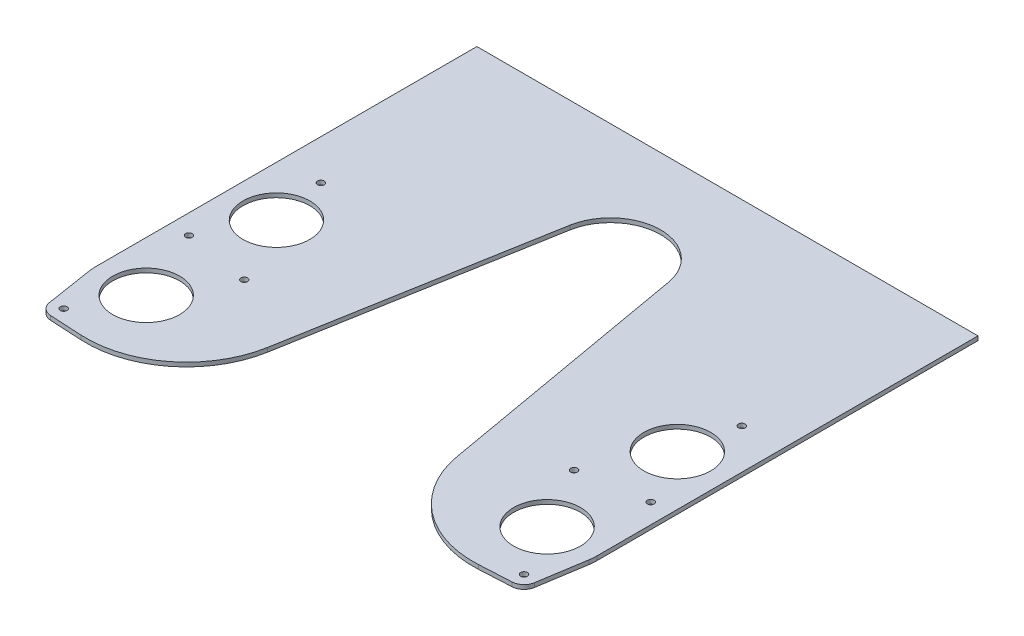
ISO-10303-21;
HEADER;
FILE_DESCRIPTION(('STEP AP214'),'2;1');
FILE_NAME('part.step','',(''),(''),'','','');
FILE_SCHEMA(('AUTOMOTIVE_DESIGN { 1 0 10303 214 1 1 1 1 }'));
ENDSEC;
DATA;
#1=APPLICATION_CONTEXT('core data for automotive mechanical design processes');
#2=APPLICATION_PROTOCOL_DEFINITION('international standard','automotive_design',2000,#1);
#3=PRODUCT_CONTEXT('',#1,'mechanical');
#4=PRODUCT('Part','Part','',(#3));
#5=PRODUCT_RELATED_PRODUCT_CATEGORY('part','',(#4));
#6=PRODUCT_DEFINITION_FORMATION('','',#4);
#7=PRODUCT_DEFINITION_CONTEXT('part definition',#1,'design');
#8=PRODUCT_DEFINITION('design','',#6,#7);
#9=PRODUCT_DEFINITION_SHAPE('','',#8);
#10=(LENGTH_UNIT() NAMED_UNIT(*) SI_UNIT(.MILLI.,.METRE.));
#11=(NAMED_UNIT(*) PLANE_ANGLE_UNIT() SI_UNIT($,.RADIAN.));
#12=(NAMED_UNIT(*) SI_UNIT($,.STERADIAN.) SOLID_ANGLE_UNIT());
#13=UNCERTAINTY_MEASURE_WITH_UNIT(LENGTH_MEASURE(1.E-05),#10,'distance_accuracy_value','');
#14=(GEOMETRIC_REPRESENTATION_CONTEXT(3) GLOBAL_UNCERTAINTY_ASSIGNED_CONTEXT((#13)) GLOBAL_UNIT_ASSIGNED_CONTEXT((#10,
#11,#12)) REPRESENTATION_CONTEXT('',''));
#15=CARTESIAN_POINT('',(0.,0.,0.));
#16=DIRECTION('',(0.,0.,1.));
#17=DIRECTION('',(1.,0.,0.));
#18=AXIS2_PLACEMENT_3D('',#15,#16,#17);
#19=CARTESIAN_POINT('',(-38.1000000000001,3.175,289.5092));
#20=DIRECTION('',(0.,-1.,0.));
#21=DIRECTION('',(0.,0.,-1.));
#22=AXIS2_PLACEMENT_3D('',#19,#20,#21);
#23=PLANE('',#22);
#24=DIRECTION('',(0.,0.,1.));
#25=VECTOR('',#24,1.);
#26=CARTESIAN_POINT('',(-381.,3.175,289.5092));
#27=LINE('',#26,#25);
#28=CARTESIAN_POINT('',(-381.,3.175,0.));
#29=VERTEX_POINT('',#28);
#30=CARTESIAN_POINT('',(-381.,3.175,289.5092));
#31=VERTEX_POINT('',#30);
#32=EDGE_CURVE('E231',#29,#31,#27,.T.);
#33=ORIENTED_EDGE('',*,*,#32,.T.);
#34=CARTESIAN_POINT('',(-342.9,3.175,289.5092));
#35=DIRECTION('',(0.,1.,0.));
#36=DIRECTION('',(0.,0.,1.));
#37=AXIS2_PLACEMENT_3D('',#34,#35,#36);
#38=CIRCLE('',#37,38.1000000000001);
#39=CARTESIAN_POINT('',(-380.532803673953,3.175,295.457484428109));
#40=VERTEX_POINT('',#39);
#41=EDGE_CURVE('E130',#31,#40,#38,.T.);
#42=ORIENTED_EDGE('',*,*,#41,.T.);
#43=DIRECTION('',(0.156122950869,0.,0.987737629237621));
#44=VECTOR('',#43,1.);
#45=CARTESIAN_POINT('',(-380.532803673953,3.175,295.457484428109));
#46=LINE('',#45,#44);
#47=CARTESIAN_POINT('',(-374.89739057959,3.175,331.110855944716));
#48=VERTEX_POINT('',#47);
#49=EDGE_CURVE('E271',#40,#48,#46,.T.);
#50=ORIENTED_EDGE('',*,*,#49,.T.);
#51=CARTESIAN_POINT('',(-365.489189661101,3.175,329.623784837689));
#52=DIRECTION('',(0.,1.,0.));
#53=DIRECTION('',(0.,0.,1.));
#54=AXIS2_PLACEMENT_3D('',#51,#52,#53);
#55=CIRCLE('',#54,9.52499999999997);
#56=CARTESIAN_POINT('',(-366.003133246036,3.175,339.134909218723));
#57=VERTEX_POINT('',#56);
#58=EDGE_CURVE('E290',#48,#57,#55,.T.);
#59=ORIENTED_EDGE('',*,*,#58,.T.);
#60=DIRECTION('',(0.998543242103337,0.,0.0539573317516356));
#61=VECTOR('',#60,1.);
#62=CARTESIAN_POINT('',(-366.003133246036,3.175,339.134909218723));
#63=LINE('',#62,#61);
#64=CARTESIAN_POINT('',(-341.613815413618,3.175,340.452811596899));
#65=VERTEX_POINT('',#64);
#66=EDGE_CURVE('E287',#57,#65,#63,.T.);
#67=ORIENTED_EDGE('',*,*,#66,.T.);
#68=CARTESIAN_POINT('',(-337.502266734144,3.175,264.363816548625));
#69=DIRECTION('',(0.,1.,0.));
#70=DIRECTION('',(0.,0.,1.));
#71=AXIS2_PLACEMENT_3D('',#68,#69,#70);
#72=CIRCLE('',#71,76.1999999999999);
#73=CARTESIAN_POINT('',(-262.459915954614,3.175,277.595807686845));
#74=VERTEX_POINT('',#73);
#75=EDGE_CURVE('E289',#65,#74,#72,.T.);
#76=ORIENTED_EDGE('',*,*,#75,.T.);
#77=DIRECTION('',(0.173648177666931,0.,-0.984807753012208));
#78=VECTOR('',#77,1.);
#79=CARTESIAN_POINT('',(-228.021175389765,3.175,82.28400443089));
#80=LINE('',#79,#78);
#81=CARTESIAN_POINT('',(-228.021175389765,3.175,82.28400443089));
#82=VERTEX_POINT('',#81);
#83=EDGE_CURVE('E292',#74,#82,#80,.T.);
#84=ORIENTED_EDGE('',*,*,#83,.T.);
#85=CARTESIAN_POINT('',(-190.5,3.175,88.9));
#86=DIRECTION('',(0.,-1.,0.));
#87=DIRECTION('',(0.,0.,1.));
#88=AXIS2_PLACEMENT_3D('',#85,#86,#87);
#89=CIRCLE('',#88,38.1);
#90=CARTESIAN_POINT('',(-152.978824610235,3.175,82.28400443089));
#91=VERTEX_POINT('',#90);
#92=EDGE_CURVE('E299',#82,#91,#89,.T.);
#93=ORIENTED_EDGE('',*,*,#92,.T.);
#94=DIRECTION('',(0.173648177666931,0.,0.984807753012208));
#95=VECTOR('',#94,1.);
#96=CARTESIAN_POINT('',(-152.978824610235,3.175,82.28400443089));
#97=LINE('',#96,#95);
#98=CARTESIAN_POINT('',(-118.540084045386,3.175,277.595807686845));
#99=VERTEX_POINT('',#98);
#100=EDGE_CURVE('E302',#91,#99,#97,.T.);
#101=ORIENTED_EDGE('',*,*,#100,.T.);
#102=CARTESIAN_POINT('',(-43.4977332658562,3.175,264.363816548625));
#103=DIRECTION('',(0.,1.,0.));
#104=DIRECTION('',(0.,0.,-1.));
#105=AXIS2_PLACEMENT_3D('',#102,#103,#104);
#106=CIRCLE('',#105,76.1999999999999);
#107=CARTESIAN_POINT('',(-39.3861845863814,3.175,340.452811596899));
#108=VERTEX_POINT('',#107);
#109=EDGE_CURVE('E305',#99,#108,#106,.T.);
#110=ORIENTED_EDGE('',*,*,#109,.T.);
#111=DIRECTION('',(0.998543242103337,0.,-0.0539573317516357));
#112=VECTOR('',#111,1.);
#113=CARTESIAN_POINT('',(-14.9968667539644,3.175,339.134909218723));
#114=LINE('',#113,#112);
#115=CARTESIAN_POINT('',(-14.9968667539644,3.175,339.134909218723));
#116=VERTEX_POINT('',#115);
#117=EDGE_CURVE('E307',#108,#116,#114,.T.);
#118=ORIENTED_EDGE('',*,*,#117,.T.);
#119=CARTESIAN_POINT('',(-15.5108103388987,3.175,329.623784837689));
#120=DIRECTION('',(0.,1.,0.));
#121=DIRECTION('',(0.,0.,-1.));
#122=AXIS2_PLACEMENT_3D('',#119,#120,#121);
#123=CIRCLE('',#122,9.52499999999997);
#124=CARTESIAN_POINT('',(-6.10260942041041,3.175,331.110855944716));
#125=VERTEX_POINT('',#124);
#126=EDGE_CURVE('E309',#116,#125,#123,.T.);
#127=ORIENTED_EDGE('',*,*,#126,.T.);
#128=DIRECTION('',(0.156122950869,0.,-0.987737629237621));
#129=VECTOR('',#128,1.);
#130=CARTESIAN_POINT('',(-0.467196326046637,3.175,295.457484428109));
#131=LINE('',#130,#129);
#132=CARTESIAN_POINT('',(-0.467196326046609,3.175,295.457484428109));
#133=VERTEX_POINT('',#132);
#134=EDGE_CURVE('E174',#125,#133,#131,.T.);
#135=ORIENTED_EDGE('',*,*,#134,.T.);
#136=CARTESIAN_POINT('',(-38.1000000000001,3.175,289.5092));
#137=DIRECTION('',(0.,1.,0.));
#138=DIRECTION('',(0.,0.,-1.));
#139=AXIS2_PLACEMENT_3D('',#136,#137,#138);
#140=CIRCLE('',#139,38.1000000000002);
#141=CARTESIAN_POINT('',(0.,3.175,289.5092));
#142=VERTEX_POINT('',#141);
#143=EDGE_CURVE('E168',#133,#142,#140,.T.);
#144=ORIENTED_EDGE('',*,*,#143,.T.);
#145=DIRECTION('',(0.,0.,-1.));
#146=VECTOR('',#145,1.);
#147=CARTESIAN_POINT('',(0.,3.175,289.5092));
#148=LINE('',#147,#146);
#149=CARTESIAN_POINT('',(0.,3.175,0.));
#150=VERTEX_POINT('',#149);
#151=EDGE_CURVE('E172',#142,#150,#148,.T.);
#152=ORIENTED_EDGE('',*,*,#151,.T.);
#153=DIRECTION('',(-1.,0.,0.));
#154=VECTOR('',#153,1.);
#155=CARTESIAN_POINT('',(0.,3.175,0.));
#156=LINE('',#155,#154);
#157=EDGE_CURVE('E62',#150,#29,#156,.T.);
#158=ORIENTED_EDGE('',*,*,#157,.T.);
#159=EDGE_LOOP('',(#33,#42,#50,#59,#67,#76,#84,#93,#101,#110,#118,#127,#135,#144,#152,#158));
#160=FACE_BOUND('',#159,.T.);
#161=CARTESIAN_POINT('',(-315.890976945233,3.175,241.975906889984));
#162=DIRECTION('',(0.,1.,0.));
#163=DIRECTION('',(0.,0.,1.));
#164=AXIS2_PLACEMENT_3D('',#161,#162,#163);
#165=CIRCLE('',#164,2.55270000000004);
#166=CARTESIAN_POINT('',(-315.890976945233,3.175,244.528606889984));
#167=VERTEX_POINT('',#166);
#168=EDGE_CURVE('E200',#167,#167,#165,.T.);
#169=ORIENTED_EDGE('',*,*,#168,.F.);
#170=EDGE_LOOP('',(#169));
#171=FACE_BOUND('',#170,.T.);
#172=CARTESIAN_POINT('',(-350.506535265853,3.175,149.065461091796));
#173=DIRECTION('',(0.,1.,0.));
#174=DIRECTION('',(0.,0.,1.));
#175=AXIS2_PLACEMENT_3D('',#172,#173,#174);
#176=CIRCLE('',#175,2.55270000000004);
#177=CARTESIAN_POINT('',(-350.506535265853,3.175,151.618161091796));
#178=VERTEX_POINT('',#177);
#179=EDGE_CURVE('E458',#178,#178,#176,.T.);
#180=ORIENTED_EDGE('',*,*,#179,.F.);
#181=EDGE_LOOP('',(#180));
#182=FACE_BOUND('',#181,.T.);
#183=CARTESIAN_POINT('',(-342.9,3.175,190.5));
#184=DIRECTION('',(0.,1.,0.));
#185=DIRECTION('',(0.,0.,1.));
#186=AXIS2_PLACEMENT_3D('',#183,#184,#185);
#187=CIRCLE('',#186,25.4);
#188=CARTESIAN_POINT('',(-342.9,3.175,215.9));
#189=VERTEX_POINT('',#188);
#190=EDGE_CURVE('E452',#189,#189,#187,.T.);
#191=ORIENTED_EDGE('',*,*,#190,.F.);
#192=EDGE_LOOP('',(#191));
#193=FACE_BOUND('',#192,.T.);
#194=CARTESIAN_POINT('',(-65.1090230547671,3.175,241.975906889984));
#195=DIRECTION('',(0.,1.,0.));
#196=DIRECTION('',(0.,0.,-1.));
#197=AXIS2_PLACEMENT_3D('',#194,#195,#196);
#198=CIRCLE('',#197,2.55270000000003);
#199=CARTESIAN_POINT('',(-65.1090230547671,3.175,239.423206889984));
#200=VERTEX_POINT('',#199);
#201=EDGE_CURVE('E445',#200,#200,#198,.T.);
#202=ORIENTED_EDGE('',*,*,#201,.F.);
#203=EDGE_LOOP('',(#202));
#204=FACE_BOUND('',#203,.T.);
#205=CARTESIAN_POINT('',(-14.9643893825028,3.175,233.842290604812));
#206=DIRECTION('',(0.,1.,0.));
#207=DIRECTION('',(0.,0.,-1.));
#208=AXIS2_PLACEMENT_3D('',#205,#206,#207);
#209=CIRCLE('',#208,2.55270000000004);
#210=CARTESIAN_POINT('',(-14.9643893825028,3.175,231.289590604812));
#211=VERTEX_POINT('',#210);
#212=EDGE_CURVE('E439',#211,#211,#209,.T.);
#213=ORIENTED_EDGE('',*,*,#212,.F.);
#214=EDGE_LOOP('',(#213));
#215=FACE_BOUND('',#214,.T.);
#216=CARTESIAN_POINT('',(-15.5108103388987,3.175,329.623784837689));
#217=DIRECTION('',(0.,1.,0.));
#218=DIRECTION('',(0.,0.,-1.));
#219=AXIS2_PLACEMENT_3D('',#216,#217,#218);
#220=CIRCLE('',#219,2.55270000000006);
#221=CARTESIAN_POINT('',(-15.5108103388987,3.175,327.071084837689));
#222=VERTEX_POINT('',#221);
#223=EDGE_CURVE('E433',#222,#222,#220,.T.);
#224=ORIENTED_EDGE('',*,*,#223,.F.);
#225=EDGE_LOOP('',(#224));
#226=FACE_BOUND('',#225,.T.);
#227=CARTESIAN_POINT('',(-366.035610617497,3.175,233.842290604812));
#228=DIRECTION('',(0.,1.,0.));
#229=DIRECTION('',(0.,0.,1.));
#230=AXIS2_PLACEMENT_3D('',#227,#228,#229);
#231=CIRCLE('',#230,2.55270000000004);
#232=CARTESIAN_POINT('',(-366.035610617497,3.175,236.394990604812));
#233=VERTEX_POINT('',#232);
#234=EDGE_CURVE('E427',#233,#233,#231,.T.);
#235=ORIENTED_EDGE('',*,*,#234,.F.);
#236=EDGE_LOOP('',(#235));
#237=FACE_BOUND('',#236,.T.);
#238=CARTESIAN_POINT('',(-342.9,3.175,289.5092));
#239=DIRECTION('',(0.,1.,0.));
#240=DIRECTION('',(0.,0.,1.));
#241=AXIS2_PLACEMENT_3D('',#238,#239,#240);
#242=CIRCLE('',#241,25.4);
#243=CARTESIAN_POINT('',(-342.9,3.175,314.9092));
#244=VERTEX_POINT('',#243);
#245=EDGE_CURVE('E421',#244,#244,#242,.T.);
#246=ORIENTED_EDGE('',*,*,#245,.F.);
#247=EDGE_LOOP('',(#246));
#248=FACE_BOUND('',#247,.T.);
#249=CARTESIAN_POINT('',(-365.489189661101,3.175,329.623784837689));
#250=DIRECTION('',(0.,1.,0.));
#251=DIRECTION('',(0.,0.,1.));
#252=AXIS2_PLACEMENT_3D('',#249,#250,#251);
#253=CIRCLE('',#252,2.55270000000003);
#254=CARTESIAN_POINT('',(-365.489189661101,3.175,332.176484837689));
#255=VERTEX_POINT('',#254);
#256=EDGE_CURVE('E415',#255,#255,#253,.T.);
#257=ORIENTED_EDGE('',*,*,#256,.F.);
#258=EDGE_LOOP('',(#257));
#259=FACE_BOUND('',#258,.T.);
#260=CARTESIAN_POINT('',(-38.1000000000001,3.175,289.5092));
#261=DIRECTION('',(0.,1.,0.));
#262=DIRECTION('',(0.,0.,-1.));
#263=AXIS2_PLACEMENT_3D('',#260,#261,#262);
#264=CIRCLE('',#263,25.4);
#265=CARTESIAN_POINT('',(-38.1000000000001,3.175,264.1092));
#266=VERTEX_POINT('',#265);
#267=EDGE_CURVE('E409',#266,#266,#264,.T.);
#268=ORIENTED_EDGE('',*,*,#267,.F.);
#269=EDGE_LOOP('',(#268));
#270=FACE_BOUND('',#269,.T.);
#271=CARTESIAN_POINT('',(-30.4934647341474,3.175,149.065461091796));
#272=DIRECTION('',(0.,1.,0.));
#273=DIRECTION('',(0.,0.,-1.));
#274=AXIS2_PLACEMENT_3D('',#271,#272,#273);
#275=CIRCLE('',#274,2.55270000000004);
#276=CARTESIAN_POINT('',(-30.4934647341474,3.175,146.512761091796));
#277=VERTEX_POINT('',#276);
#278=EDGE_CURVE('E401',#277,#277,#275,.T.);
#279=ORIENTED_EDGE('',*,*,#278,.F.);
#280=EDGE_LOOP('',(#279));
#281=FACE_BOUND('',#280,.T.);
#282=CARTESIAN_POINT('',(-38.1,3.175,190.5));
#283=DIRECTION('',(0.,1.,0.));
#284=DIRECTION('',(0.,0.,-1.));
#285=AXIS2_PLACEMENT_3D('',#282,#283,#284);
#286=CIRCLE('',#285,25.4);
#287=CARTESIAN_POINT('',(-38.1,3.175,165.1));
#288=VERTEX_POINT('',#287);
#289=EDGE_CURVE('E390',#288,#288,#286,.T.);
#290=ORIENTED_EDGE('',*,*,#289,.F.);
#291=EDGE_LOOP('',(#290));
#292=FACE_BOUND('',#291,.T.);
#293=ADVANCED_FACE('F45',(#160,#171,#182,#193,#204,#215,#226,#237,#248,#259,#270,#281,#292),#23,.F.);
#294=CARTESIAN_POINT('',(-38.1000000000001,0.,289.5092));
#295=DIRECTION('',(0.,-1.,0.));
#296=DIRECTION('',(0.,0.,-1.));
#297=AXIS2_PLACEMENT_3D('',#294,#295,#296);
#298=PLANE('',#297);
#299=CARTESIAN_POINT('',(-30.4934647341474,0.,149.065461091796));
#300=DIRECTION('',(0.,1.,0.));
#301=DIRECTION('',(0.,0.,-1.));
#302=AXIS2_PLACEMENT_3D('',#299,#300,#301);
#303=CIRCLE('',#302,2.55270000000004);
#304=CARTESIAN_POINT('',(-30.4934647341474,0.,146.512761091796));
#305=VERTEX_POINT('',#304);
#306=EDGE_CURVE('E398',#305,#305,#303,.T.);
#307=ORIENTED_EDGE('',*,*,#306,.T.);
#308=EDGE_LOOP('',(#307));
#309=FACE_BOUND('',#308,.T.);
#310=CARTESIAN_POINT('',(-365.489189661101,0.,329.623784837689));
#311=DIRECTION('',(0.,1.,0.));
#312=DIRECTION('',(0.,0.,1.));
#313=AXIS2_PLACEMENT_3D('',#310,#311,#312);
#314=CIRCLE('',#313,2.55270000000003);
#315=CARTESIAN_POINT('',(-365.489189661101,0.,332.176484837689));
#316=VERTEX_POINT('',#315);
#317=EDGE_CURVE('E412',#316,#316,#314,.T.);
#318=ORIENTED_EDGE('',*,*,#317,.T.);
#319=EDGE_LOOP('',(#318));
#320=FACE_BOUND('',#319,.T.);
#321=CARTESIAN_POINT('',(-366.035610617497,0.,233.842290604812));
#322=DIRECTION('',(0.,1.,0.));
#323=DIRECTION('',(0.,0.,1.));
#324=AXIS2_PLACEMENT_3D('',#321,#322,#323);
#325=CIRCLE('',#324,2.55270000000004);
#326=CARTESIAN_POINT('',(-366.035610617497,0.,236.394990604812));
#327=VERTEX_POINT('',#326);
#328=EDGE_CURVE('E424',#327,#327,#325,.T.);
#329=ORIENTED_EDGE('',*,*,#328,.T.);
#330=EDGE_LOOP('',(#329));
#331=FACE_BOUND('',#330,.T.);
#332=CARTESIAN_POINT('',(-14.9643893825028,0.,233.842290604812));
#333=DIRECTION('',(0.,1.,0.));
#334=DIRECTION('',(0.,0.,-1.));
#335=AXIS2_PLACEMENT_3D('',#332,#333,#334);
#336=CIRCLE('',#335,2.55270000000004);
#337=CARTESIAN_POINT('',(-14.9643893825028,0.,231.289590604812));
#338=VERTEX_POINT('',#337);
#339=EDGE_CURVE('E436',#338,#338,#336,.T.);
#340=ORIENTED_EDGE('',*,*,#339,.T.);
#341=EDGE_LOOP('',(#340));
#342=FACE_BOUND('',#341,.T.);
#343=CARTESIAN_POINT('',(-342.9,0.,190.5));
#344=DIRECTION('',(0.,1.,0.));
#345=DIRECTION('',(0.,0.,1.));
#346=AXIS2_PLACEMENT_3D('',#343,#344,#345);
#347=CIRCLE('',#346,25.4);
#348=CARTESIAN_POINT('',(-342.9,0.,215.9));
#349=VERTEX_POINT('',#348);
#350=EDGE_CURVE('E449',#349,#349,#347,.T.);
#351=ORIENTED_EDGE('',*,*,#350,.T.);
#352=EDGE_LOOP('',(#351));
#353=FACE_BOUND('',#352,.T.);
#354=CARTESIAN_POINT('',(-315.890976945233,0.,241.975906889984));
#355=DIRECTION('',(0.,1.,0.));
#356=DIRECTION('',(0.,0.,1.));
#357=AXIS2_PLACEMENT_3D('',#354,#355,#356);
#358=CIRCLE('',#357,2.55270000000004);
#359=CARTESIAN_POINT('',(-315.890976945233,0.,244.528606889984));
#360=VERTEX_POINT('',#359);
#361=EDGE_CURVE('E461',#360,#360,#358,.T.);
#362=ORIENTED_EDGE('',*,*,#361,.T.);
#363=EDGE_LOOP('',(#362));
#364=FACE_BOUND('',#363,.T.);
#365=DIRECTION('',(0.,0.,1.));
#366=VECTOR('',#365,1.);
#367=CARTESIAN_POINT('',(-381.,0.,289.5092));
#368=LINE('',#367,#366);
#369=CARTESIAN_POINT('',(-381.,0.,0.));
#370=VERTEX_POINT('',#369);
#371=CARTESIAN_POINT('',(-381.,0.,289.5092));
#372=VERTEX_POINT('',#371);
#373=EDGE_CURVE('E196',#370,#372,#368,.T.);
#374=ORIENTED_EDGE('',*,*,#373,.F.);
#375=DIRECTION('',(-1.,0.,0.));
#376=VECTOR('',#375,1.);
#377=CARTESIAN_POINT('',(0.,0.,0.));
#378=LINE('',#377,#376);
#379=CARTESIAN_POINT('',(0.,0.,0.));
#380=VERTEX_POINT('',#379);
#381=EDGE_CURVE('E122',#380,#370,#378,.T.);
#382=ORIENTED_EDGE('',*,*,#381,.F.);
#383=DIRECTION('',(0.,0.,-1.));
#384=VECTOR('',#383,1.);
#385=CARTESIAN_POINT('',(0.,0.,289.5092));
#386=LINE('',#385,#384);
#387=CARTESIAN_POINT('',(0.,0.,289.5092));
#388=VERTEX_POINT('',#387);
#389=EDGE_CURVE('E116',#388,#380,#386,.T.);
#390=ORIENTED_EDGE('',*,*,#389,.F.);
#391=CARTESIAN_POINT('',(-38.1000000000001,0.,289.5092));
#392=DIRECTION('',(0.,1.,0.));
#393=DIRECTION('',(0.,0.,-1.));
#394=AXIS2_PLACEMENT_3D('',#391,#392,#393);
#395=CIRCLE('',#394,38.1000000000002);
#396=CARTESIAN_POINT('',(-0.467196326046609,0.,295.457484428109));
#397=VERTEX_POINT('',#396);
#398=EDGE_CURVE('E182',#397,#388,#395,.T.);
#399=ORIENTED_EDGE('',*,*,#398,.F.);
#400=DIRECTION('',(0.156122950869,0.,-0.987737629237621));
#401=VECTOR('',#400,1.);
#402=CARTESIAN_POINT('',(-0.467196326046637,0.,295.457484428109));
#403=LINE('',#402,#401);
#404=CARTESIAN_POINT('',(-6.10260942041041,0.,331.110855944716));
#405=VERTEX_POINT('',#404);
#406=EDGE_CURVE('E225',#405,#397,#403,.T.);
#407=ORIENTED_EDGE('',*,*,#406,.F.);
#408=CARTESIAN_POINT('',(-15.5108103388987,0.,329.623784837689));
#409=DIRECTION('',(0.,1.,0.));
#410=DIRECTION('',(0.,0.,-1.));
#411=AXIS2_PLACEMENT_3D('',#408,#409,#410);
#412=CIRCLE('',#411,9.52499999999997);
#413=CARTESIAN_POINT('',(-14.9968667539644,0.,339.134909218723));
#414=VERTEX_POINT('',#413);
#415=EDGE_CURVE('E223',#414,#405,#412,.T.);
#416=ORIENTED_EDGE('',*,*,#415,.F.);
#417=DIRECTION('',(0.998543242103337,0.,-0.0539573317516357));
#418=VECTOR('',#417,1.);
#419=CARTESIAN_POINT('',(-14.9968667539644,0.,339.134909218723));
#420=LINE('',#419,#418);
#421=CARTESIAN_POINT('',(-39.3861845863814,0.,340.452811596899));
#422=VERTEX_POINT('',#421);
#423=EDGE_CURVE('E221',#422,#414,#420,.T.);
#424=ORIENTED_EDGE('',*,*,#423,.F.);
#425=CARTESIAN_POINT('',(-43.4977332658562,0.,264.363816548625));
#426=DIRECTION('',(0.,1.,0.));
#427=DIRECTION('',(0.,0.,-1.));
#428=AXIS2_PLACEMENT_3D('',#425,#426,#427);
#429=CIRCLE('',#428,76.1999999999999);
#430=CARTESIAN_POINT('',(-118.540084045386,0.,277.595807686845));
#431=VERTEX_POINT('',#430);
#432=EDGE_CURVE('E219',#431,#422,#429,.T.);
#433=ORIENTED_EDGE('',*,*,#432,.F.);
#434=DIRECTION('',(0.173648177666931,0.,0.984807753012208));
#435=VECTOR('',#434,1.);
#436=CARTESIAN_POINT('',(-152.978824610235,0.,82.28400443089));
#437=LINE('',#436,#435);
#438=CARTESIAN_POINT('',(-152.978824610235,0.,82.28400443089));
#439=VERTEX_POINT('',#438);
#440=EDGE_CURVE('E216',#439,#431,#437,.T.);
#441=ORIENTED_EDGE('',*,*,#440,.F.);
#442=CARTESIAN_POINT('',(-190.5,0.,88.9));
#443=DIRECTION('',(0.,-1.,0.));
#444=DIRECTION('',(0.,0.,1.));
#445=AXIS2_PLACEMENT_3D('',#442,#443,#444);
#446=CIRCLE('',#445,38.1);
#447=CARTESIAN_POINT('',(-228.021175389765,0.,82.28400443089));
#448=VERTEX_POINT('',#447);
#449=EDGE_CURVE('E213',#448,#439,#446,.T.);
#450=ORIENTED_EDGE('',*,*,#449,.F.);
#451=DIRECTION('',(0.173648177666931,0.,-0.984807753012208));
#452=VECTOR('',#451,1.);
#453=CARTESIAN_POINT('',(-228.021175389765,0.,82.28400443089));
#454=LINE('',#453,#452);
#455=CARTESIAN_POINT('',(-262.459915954614,0.,277.595807686845));
#456=VERTEX_POINT('',#455);
#457=EDGE_CURVE('E210',#456,#448,#454,.T.);
#458=ORIENTED_EDGE('',*,*,#457,.F.);
#459=CARTESIAN_POINT('',(-337.502266734144,0.,264.363816548625));
#460=DIRECTION('',(0.,1.,0.));
#461=DIRECTION('',(0.,0.,1.));
#462=AXIS2_PLACEMENT_3D('',#459,#460,#461);
#463=CIRCLE('',#462,76.1999999999999);
#464=CARTESIAN_POINT('',(-341.613815413618,0.,340.452811596899));
#465=VERTEX_POINT('',#464);
#466=EDGE_CURVE('E208',#465,#456,#463,.T.);
#467=ORIENTED_EDGE('',*,*,#466,.F.);
#468=DIRECTION('',(0.998543242103337,0.,0.0539573317516356));
#469=VECTOR('',#468,1.);
#470=CARTESIAN_POINT('',(-366.003133246036,0.,339.134909218723));
#471=LINE('',#470,#469);
#472=CARTESIAN_POINT('',(-366.003133246036,0.,339.134909218723));
#473=VERTEX_POINT('',#472);
#474=EDGE_CURVE('E206',#473,#465,#471,.T.);
#475=ORIENTED_EDGE('',*,*,#474,.F.);
#476=CARTESIAN_POINT('',(-365.489189661101,0.,329.623784837689));
#477=DIRECTION('',(0.,1.,0.));
#478=DIRECTION('',(0.,0.,1.));
#479=AXIS2_PLACEMENT_3D('',#476,#477,#478);
#480=CIRCLE('',#479,9.52499999999997);
#481=CARTESIAN_POINT('',(-374.89739057959,0.,331.110855944716));
#482=VERTEX_POINT('',#481);
#483=EDGE_CURVE('E204',#482,#473,#480,.T.);
#484=ORIENTED_EDGE('',*,*,#483,.F.);
#485=DIRECTION('',(0.156122950869,0.,0.987737629237621));
#486=VECTOR('',#485,1.);
#487=CARTESIAN_POINT('',(-380.532803673953,0.,295.457484428109));
#488=LINE('',#487,#486);
#489=CARTESIAN_POINT('',(-380.532803673953,0.,295.457484428109));
#490=VERTEX_POINT('',#489);
#491=EDGE_CURVE('E202',#490,#482,#488,.T.);
#492=ORIENTED_EDGE('',*,*,#491,.F.);
#493=CARTESIAN_POINT('',(-342.9,0.,289.5092));
#494=DIRECTION('',(0.,1.,0.));
#495=DIRECTION('',(0.,0.,1.));
#496=AXIS2_PLACEMENT_3D('',#493,#494,#495);
#497=CIRCLE('',#496,38.1000000000001);
#498=EDGE_CURVE('E199',#372,#490,#497,.T.);
#499=ORIENTED_EDGE('',*,*,#498,.F.);
#500=EDGE_LOOP('',(#374,#382,#390,#399,#407,#416,#424,#433,#441,#450,#458,#467,#475,#484,#492,#499));
#501=FACE_BOUND('',#500,.T.);
#502=CARTESIAN_POINT('',(-350.506535265853,0.,149.065461091796));
#503=DIRECTION('',(0.,1.,0.));
#504=DIRECTION('',(0.,0.,1.));
#505=AXIS2_PLACEMENT_3D('',#502,#503,#504);
#506=CIRCLE('',#505,2.55270000000004);
#507=CARTESIAN_POINT('',(-350.506535265853,0.,151.618161091796));
#508=VERTEX_POINT('',#507);
#509=EDGE_CURVE('E455',#508,#508,#506,.T.);
#510=ORIENTED_EDGE('',*,*,#509,.T.);
#511=EDGE_LOOP('',(#510));
#512=FACE_BOUND('',#511,.T.);
#513=CARTESIAN_POINT('',(-65.1090230547671,0.,241.975906889984));
#514=DIRECTION('',(0.,1.,0.));
#515=DIRECTION('',(0.,0.,-1.));
#516=AXIS2_PLACEMENT_3D('',#513,#514,#515);
#517=CIRCLE('',#516,2.55270000000003);
#518=CARTESIAN_POINT('',(-65.1090230547671,0.,239.423206889984));
#519=VERTEX_POINT('',#518);
#520=EDGE_CURVE('E442',#519,#519,#517,.T.);
#521=ORIENTED_EDGE('',*,*,#520,.T.);
#522=EDGE_LOOP('',(#521));
#523=FACE_BOUND('',#522,.T.);
#524=CARTESIAN_POINT('',(-15.5108103388987,0.,329.623784837689));
#525=DIRECTION('',(0.,1.,0.));
#526=DIRECTION('',(0.,0.,-1.));
#527=AXIS2_PLACEMENT_3D('',#524,#525,#526);
#528=CIRCLE('',#527,2.55270000000006);
#529=CARTESIAN_POINT('',(-15.5108103388987,0.,327.071084837689));
#530=VERTEX_POINT('',#529);
#531=EDGE_CURVE('E430',#530,#530,#528,.T.);
#532=ORIENTED_EDGE('',*,*,#531,.T.);
#533=EDGE_LOOP('',(#532));
#534=FACE_BOUND('',#533,.T.);
#535=CARTESIAN_POINT('',(-342.9,0.,289.5092));
#536=DIRECTION('',(0.,1.,0.));
#537=DIRECTION('',(0.,0.,1.));
#538=AXIS2_PLACEMENT_3D('',#535,#536,#537);
#539=CIRCLE('',#538,25.4);
#540=CARTESIAN_POINT('',(-342.9,0.,314.9092));
#541=VERTEX_POINT('',#540);
#542=EDGE_CURVE('E418',#541,#541,#539,.T.);
#543=ORIENTED_EDGE('',*,*,#542,.T.);
#544=EDGE_LOOP('',(#543));
#545=FACE_BOUND('',#544,.T.);
#546=CARTESIAN_POINT('',(-38.1000000000001,0.,289.5092));
#547=DIRECTION('',(0.,1.,0.));
#548=DIRECTION('',(0.,0.,-1.));
#549=AXIS2_PLACEMENT_3D('',#546,#547,#548);
#550=CIRCLE('',#549,25.4);
#551=CARTESIAN_POINT('',(-38.1000000000001,0.,264.1092));
#552=VERTEX_POINT('',#551);
#553=EDGE_CURVE('E405',#552,#552,#550,.T.);
#554=ORIENTED_EDGE('',*,*,#553,.T.);
#555=EDGE_LOOP('',(#554));
#556=FACE_BOUND('',#555,.T.);
#557=CARTESIAN_POINT('',(-38.1,0.,190.5));
#558=DIRECTION('',(0.,1.,0.));
#559=DIRECTION('',(0.,0.,-1.));
#560=AXIS2_PLACEMENT_3D('',#557,#558,#559);
#561=CIRCLE('',#560,25.4);
#562=CARTESIAN_POINT('',(-38.1,0.,165.1));
#563=VERTEX_POINT('',#562);
#564=EDGE_CURVE('E393',#563,#563,#561,.T.);
#565=ORIENTED_EDGE('',*,*,#564,.T.);
#566=EDGE_LOOP('',(#565));
#567=FACE_BOUND('',#566,.T.);
#568=ADVANCED_FACE('F275',(#309,#320,#331,#342,#353,#364,#501,#512,#523,#534,#545,#556,#567),
#298,.T.);
#569=CARTESIAN_POINT('',(-381.,3.175,289.5092));
#570=DIRECTION('',(1.,0.,0.));
#571=DIRECTION('',(0.,0.,-1.));
#572=AXIS2_PLACEMENT_3D('',#569,#570,#571);
#573=PLANE('',#572);
#574=ORIENTED_EDGE('',*,*,#373,.T.);
#575=DIRECTION('',(0.,-1.,0.));
#576=VECTOR('',#575,1.);
#577=CARTESIAN_POINT('',(-381.,3.175,289.5092));
#578=LINE('',#577,#576);
#579=EDGE_CURVE('E11',#31,#372,#578,.T.);
#580=ORIENTED_EDGE('',*,*,#579,.F.);
#581=ORIENTED_EDGE('',*,*,#32,.F.);
#582=DIRECTION('',(0.,-1.,0.));
#583=VECTOR('',#582,1.);
#584=CARTESIAN_POINT('',(-381.,3.175,0.));
#585=LINE('',#584,#583);
#586=EDGE_CURVE('E192',#29,#370,#585,.T.);
#587=ORIENTED_EDGE('',*,*,#586,.T.);
#588=EDGE_LOOP('',(#574,#580,#581,#587));
#589=FACE_BOUND('',#588,.T.);
#590=ADVANCED_FACE('F47',(#589),#573,.F.);
#591=CARTESIAN_POINT('',(-342.9,3.175,289.5092));
#592=DIRECTION('',(0.,-1.,0.));
#593=DIRECTION('',(0.,0.,-1.));
#594=AXIS2_PLACEMENT_3D('',#591,#592,#593);
#595=CYLINDRICAL_SURFACE('',#594,38.1000000000001);
#596=ORIENTED_EDGE('',*,*,#498,.T.);
#597=DIRECTION('',(0.,-1.,0.));
#598=VECTOR('',#597,1.);
#599=CARTESIAN_POINT('',(-380.532803673953,3.175,295.457484428109));
#600=LINE('',#599,#598);
#601=EDGE_CURVE('E54',#40,#490,#600,.T.);
#602=ORIENTED_EDGE('',*,*,#601,.F.);
#603=ORIENTED_EDGE('',*,*,#41,.F.);
#604=ORIENTED_EDGE('',*,*,#579,.T.);
#605=EDGE_LOOP('',(#596,#602,#603,#604));
#606=FACE_BOUND('',#605,.T.);
#607=ADVANCED_FACE('F700',(#606),#595,.T.);
#608=CARTESIAN_POINT('',(-380.532803673953,3.175,295.457484428109));
#609=DIRECTION('',(0.987737629237621,0.,-0.156122950869));
#610=DIRECTION('',(-0.156122950869,0.,-0.987737629237621));
#611=AXIS2_PLACEMENT_3D('',#608,#609,#610);
#612=PLANE('',#611);
#613=ORIENTED_EDGE('',*,*,#491,.T.);
#614=DIRECTION('',(0.,-1.,0.));
#615=VECTOR('',#614,1.);
#616=CARTESIAN_POINT('',(-374.89739057959,3.175,331.110855944716));
#617=LINE('',#616,#615);
#618=EDGE_CURVE('E263',#48,#482,#617,.T.);
#619=ORIENTED_EDGE('',*,*,#618,.F.);
#620=ORIENTED_EDGE('',*,*,#49,.F.);
#621=ORIENTED_EDGE('',*,*,#601,.T.);
#622=EDGE_LOOP('',(#613,#619,#620,#621));
#623=FACE_BOUND('',#622,.T.);
#624=ADVANCED_FACE('F269',(#623),#612,.F.);
#625=CARTESIAN_POINT('',(-365.489189661101,3.175,329.623784837689));
#626=DIRECTION('',(0.,-1.,0.));
#627=DIRECTION('',(0.,0.,-1.));
#628=AXIS2_PLACEMENT_3D('',#625,#626,#627);
#629=CYLINDRICAL_SURFACE('',#628,9.52499999999997);
#630=ORIENTED_EDGE('',*,*,#483,.T.);
#631=DIRECTION('',(0.,-1.,0.));
#632=VECTOR('',#631,1.);
#633=CARTESIAN_POINT('',(-366.003133246036,3.175,339.134909218723));
#634=LINE('',#633,#632);
#635=EDGE_CURVE('E260',#57,#473,#634,.T.);
#636=ORIENTED_EDGE('',*,*,#635,.F.);
#637=ORIENTED_EDGE('',*,*,#58,.F.);
#638=ORIENTED_EDGE('',*,*,#618,.T.);
#639=EDGE_LOOP('',(#630,#636,#637,#638));
#640=FACE_BOUND('',#639,.T.);
#641=ADVANCED_FACE('F281',(#640),#629,.T.);
#642=CARTESIAN_POINT('',(-366.003133246036,3.175,339.134909218723));
#643=DIRECTION('',(0.0539573317516356,0.,-0.998543242103337));
#644=DIRECTION('',(-0.998543242103337,0.,-0.0539573317516356));
#645=AXIS2_PLACEMENT_3D('',#642,#643,#644);
#646=PLANE('',#645);
#647=ORIENTED_EDGE('',*,*,#474,.T.);
#648=DIRECTION('',(0.,-1.,0.));
#649=VECTOR('',#648,1.);
#650=CARTESIAN_POINT('',(-341.613815413618,3.175,340.452811596899));
#651=LINE('',#650,#649);
#652=EDGE_CURVE('E257',#65,#465,#651,.T.);
#653=ORIENTED_EDGE('',*,*,#652,.F.);
#654=ORIENTED_EDGE('',*,*,#66,.F.);
#655=ORIENTED_EDGE('',*,*,#635,.T.);
#656=EDGE_LOOP('',(#647,#653,#654,#655));
#657=FACE_BOUND('',#656,.T.);
#658=ADVANCED_FACE('F285',(#657),#646,.F.);
#659=CARTESIAN_POINT('',(-337.502266734144,3.175,264.363816548625));
#660=DIRECTION('',(0.,-1.,0.));
#661=DIRECTION('',(0.,0.,-1.));
#662=AXIS2_PLACEMENT_3D('',#659,#660,#661);
#663=CYLINDRICAL_SURFACE('',#662,76.1999999999999);
#664=ORIENTED_EDGE('',*,*,#466,.T.);
#665=DIRECTION('',(0.,-1.,0.));
#666=VECTOR('',#665,1.);
#667=CARTESIAN_POINT('',(-262.459915954614,3.175,277.595807686845));
#668=LINE('',#667,#666);
#669=EDGE_CURVE('E254',#74,#456,#668,.T.);
#670=ORIENTED_EDGE('',*,*,#669,.F.);
#671=ORIENTED_EDGE('',*,*,#75,.F.);
#672=ORIENTED_EDGE('',*,*,#652,.T.);
#673=EDGE_LOOP('',(#664,#670,#671,#672));
#674=FACE_BOUND('',#673,.T.);
#675=ADVANCED_FACE('F661',(#674),#663,.T.);
#676=CARTESIAN_POINT('',(-228.021175389765,3.175,82.28400443089));
#677=DIRECTION('',(-0.984807753012208,0.,-0.173648177666931));
#678=DIRECTION('',(-0.173648177666931,0.,0.984807753012208));
#679=AXIS2_PLACEMENT_3D('',#676,#677,#678);
#680=PLANE('',#679);
#681=ORIENTED_EDGE('',*,*,#457,.T.);
#682=DIRECTION('',(0.,-1.,0.));
#683=VECTOR('',#682,1.);
#684=CARTESIAN_POINT('',(-228.021175389765,3.175,82.28400443089));
#685=LINE('',#684,#683);
#686=EDGE_CURVE('E251',#82,#448,#685,.T.);
#687=ORIENTED_EDGE('',*,*,#686,.F.);
#688=ORIENTED_EDGE('',*,*,#83,.F.);
#689=ORIENTED_EDGE('',*,*,#669,.T.);
#690=EDGE_LOOP('',(#681,#687,#688,#689));
#691=FACE_BOUND('',#690,.T.);
#692=ADVANCED_FACE('F650',(#691),#680,.F.);
#693=CARTESIAN_POINT('',(-190.5,3.175,88.9));
#694=DIRECTION('',(0.,-1.,0.));
#695=DIRECTION('',(0.,0.,-1.));
#696=AXIS2_PLACEMENT_3D('',#693,#694,#695);
#697=CYLINDRICAL_SURFACE('',#696,38.1);
#698=ORIENTED_EDGE('',*,*,#449,.T.);
#699=DIRECTION('',(0.,-1.,0.));
#700=VECTOR('',#699,1.);
#701=CARTESIAN_POINT('',(-152.978824610235,3.175,82.28400443089));
#702=LINE('',#701,#700);
#703=EDGE_CURVE('E247',#91,#439,#702,.T.);
#704=ORIENTED_EDGE('',*,*,#703,.F.);
#705=ORIENTED_EDGE('',*,*,#92,.F.);
#706=ORIENTED_EDGE('',*,*,#686,.T.);
#707=EDGE_LOOP('',(#698,#704,#705,#706));
#708=FACE_BOUND('',#707,.T.);
#709=ADVANCED_FACE('F639',(#708),#697,.F.);
#710=CARTESIAN_POINT('',(-152.978824610235,3.175,82.28400443089));
#711=DIRECTION('',(0.984807753012208,0.,-0.173648177666931));
#712=DIRECTION('',(-0.173648177666931,0.,-0.984807753012208));
#713=AXIS2_PLACEMENT_3D('',#710,#711,#712);
#714=PLANE('',#713);
#715=ORIENTED_EDGE('',*,*,#440,.T.);
#716=DIRECTION('',(0.,-1.,0.));
#717=VECTOR('',#716,1.);
#718=CARTESIAN_POINT('',(-118.540084045386,3.175,277.595807686845));
#719=LINE('',#718,#717);
#720=EDGE_CURVE('E244',#99,#431,#719,.T.);
#721=ORIENTED_EDGE('',*,*,#720,.F.);
#722=ORIENTED_EDGE('',*,*,#100,.F.);
#723=ORIENTED_EDGE('',*,*,#703,.T.);
#724=EDGE_LOOP('',(#715,#721,#722,#723));
#725=FACE_BOUND('',#724,.T.);
#726=ADVANCED_FACE('F628',(#725),#714,.F.);
#727=CARTESIAN_POINT('',(-43.4977332658562,3.175,264.363816548625));
#728=DIRECTION('',(0.,-1.,0.));
#729=DIRECTION('',(0.,0.,-1.));
#730=AXIS2_PLACEMENT_3D('',#727,#728,#729);
#731=CYLINDRICAL_SURFACE('',#730,76.1999999999999);
#732=ORIENTED_EDGE('',*,*,#432,.T.);
#733=DIRECTION('',(0.,-1.,0.));
#734=VECTOR('',#733,1.);
#735=CARTESIAN_POINT('',(-39.3861845863814,3.175,340.452811596899));
#736=LINE('',#735,#734);
#737=EDGE_CURVE('E241',#108,#422,#736,.T.);
#738=ORIENTED_EDGE('',*,*,#737,.F.);
#739=ORIENTED_EDGE('',*,*,#109,.F.);
#740=ORIENTED_EDGE('',*,*,#720,.T.);
#741=EDGE_LOOP('',(#732,#738,#739,#740));
#742=FACE_BOUND('',#741,.T.);
#743=ADVANCED_FACE('F617',(#742),#731,.T.);
#744=CARTESIAN_POINT('',(-14.9968667539644,3.175,339.134909218723));
#745=DIRECTION('',(-0.0539573317516357,0.,-0.998543242103337));
#746=DIRECTION('',(-0.998543242103337,0.,0.0539573317516357));
#747=AXIS2_PLACEMENT_3D('',#744,#745,#746);
#748=PLANE('',#747);
#749=ORIENTED_EDGE('',*,*,#423,.T.);
#750=DIRECTION('',(0.,-1.,0.));
#751=VECTOR('',#750,1.);
#752=CARTESIAN_POINT('',(-14.9968667539644,3.175,339.134909218723));
#753=LINE('',#752,#751);
#754=EDGE_CURVE('E238',#116,#414,#753,.T.);
#755=ORIENTED_EDGE('',*,*,#754,.F.);
#756=ORIENTED_EDGE('',*,*,#117,.F.);
#757=ORIENTED_EDGE('',*,*,#737,.T.);
#758=EDGE_LOOP('',(#749,#755,#756,#757));
#759=FACE_BOUND('',#758,.T.);
#760=ADVANCED_FACE('F607',(#759),#748,.F.);
#761=CARTESIAN_POINT('',(-15.5108103388987,3.175,329.623784837689));
#762=DIRECTION('',(0.,-1.,0.));
#763=DIRECTION('',(0.,0.,-1.));
#764=AXIS2_PLACEMENT_3D('',#761,#762,#763);
#765=CYLINDRICAL_SURFACE('',#764,9.52499999999997);
#766=ORIENTED_EDGE('',*,*,#415,.T.);
#767=DIRECTION('',(0.,-1.,0.));
#768=VECTOR('',#767,1.);
#769=CARTESIAN_POINT('',(-6.10260942041041,3.175,331.110855944716));
#770=LINE('',#769,#768);
#771=EDGE_CURVE('E235',#125,#405,#770,.T.);
#772=ORIENTED_EDGE('',*,*,#771,.F.);
#773=ORIENTED_EDGE('',*,*,#126,.F.);
#774=ORIENTED_EDGE('',*,*,#754,.T.);
#775=EDGE_LOOP('',(#766,#772,#773,#774));
#776=FACE_BOUND('',#775,.T.);
#777=ADVANCED_FACE('F315',(#776),#765,.T.);
#778=CARTESIAN_POINT('',(-0.467196326046637,3.175,295.457484428109));
#779=DIRECTION('',(-0.987737629237621,0.,-0.156122950869));
#780=DIRECTION('',(-0.156122950869,0.,0.987737629237621));
#781=AXIS2_PLACEMENT_3D('',#778,#779,#780);
#782=PLANE('',#781);
#783=ORIENTED_EDGE('',*,*,#406,.T.);
#784=DIRECTION('',(0.,-1.,0.));
#785=VECTOR('',#784,1.);
#786=CARTESIAN_POINT('',(-0.467196326046609,3.175,295.457484428109));
#787=LINE('',#786,#785);
#788=EDGE_CURVE('E183',#133,#397,#787,.T.);
#789=ORIENTED_EDGE('',*,*,#788,.F.);
#790=ORIENTED_EDGE('',*,*,#134,.F.);
#791=ORIENTED_EDGE('',*,*,#771,.T.);
#792=EDGE_LOOP('',(#783,#789,#790,#791));
#793=FACE_BOUND('',#792,.T.);
#794=ADVANCED_FACE('F319',(#793),#782,.F.);
#795=CARTESIAN_POINT('',(-38.1000000000001,3.175,289.5092));
#796=DIRECTION('',(0.,-1.,0.));
#797=DIRECTION('',(0.,0.,-1.));
#798=AXIS2_PLACEMENT_3D('',#795,#796,#797);
#799=CYLINDRICAL_SURFACE('',#798,38.1000000000002);
#800=ORIENTED_EDGE('',*,*,#398,.T.);
#801=DIRECTION('',(0.,-1.,0.));
#802=VECTOR('',#801,1.);
#803=CARTESIAN_POINT('',(0.,3.175,289.5092));
#804=LINE('',#803,#802);
#805=EDGE_CURVE('E179',#142,#388,#804,.T.);
#806=ORIENTED_EDGE('',*,*,#805,.F.);
#807=ORIENTED_EDGE('',*,*,#143,.F.);
#808=ORIENTED_EDGE('',*,*,#788,.T.);
#809=EDGE_LOOP('',(#800,#806,#807,#808));
#810=FACE_BOUND('',#809,.T.);
#811=ADVANCED_FACE('F180',(#810),#799,.T.);
#812=CARTESIAN_POINT('',(0.,3.175,289.5092));
#813=DIRECTION('',(-1.,0.,0.));
#814=DIRECTION('',(0.,0.,1.));
#815=AXIS2_PLACEMENT_3D('',#812,#813,#814);
#816=PLANE('',#815);
#817=ORIENTED_EDGE('',*,*,#389,.T.);
#818=DIRECTION('',(0.,-1.,0.));
#819=VECTOR('',#818,1.);
#820=CARTESIAN_POINT('',(0.,3.175,0.));
#821=LINE('',#820,#819);
#822=EDGE_CURVE('E184',#150,#380,#821,.T.);
#823=ORIENTED_EDGE('',*,*,#822,.F.);
#824=ORIENTED_EDGE('',*,*,#151,.F.);
#825=ORIENTED_EDGE('',*,*,#805,.T.);
#826=EDGE_LOOP('',(#817,#823,#824,#825));
#827=FACE_BOUND('',#826,.T.);
#828=ADVANCED_FACE('F186',(#827),#816,.F.);
#829=CARTESIAN_POINT('',(0.,3.175,0.));
#830=DIRECTION('',(0.,0.,1.));
#831=DIRECTION('',(1.,0.,0.));
#832=AXIS2_PLACEMENT_3D('',#829,#830,#831);
#833=PLANE('',#832);
#834=ORIENTED_EDGE('',*,*,#381,.T.);
#835=ORIENTED_EDGE('',*,*,#586,.F.);
#836=ORIENTED_EDGE('',*,*,#157,.F.);
#837=ORIENTED_EDGE('',*,*,#822,.T.);
#838=EDGE_LOOP('',(#834,#835,#836,#837));
#839=FACE_BOUND('',#838,.T.);
#840=ADVANCED_FACE('F323',(#839),#833,.F.);
#841=CARTESIAN_POINT('',(-315.890976945233,3.175,241.975906889984));
#842=DIRECTION('',(0.,-1.,0.));
#843=DIRECTION('',(0.,0.,-1.));
#844=AXIS2_PLACEMENT_3D('',#841,#842,#843);
#845=CYLINDRICAL_SURFACE('',#844,2.55270000000004);
#846=ORIENTED_EDGE('',*,*,#168,.T.);
#847=EDGE_LOOP('',(#846));
#848=FACE_BOUND('',#847,.T.);
#849=ORIENTED_EDGE('',*,*,#361,.F.);
#850=EDGE_LOOP('',(#849));
#851=FACE_BOUND('',#850,.T.);
#852=ADVANCED_FACE('F325',(#848,#851),#845,.F.);
#853=CARTESIAN_POINT('',(-350.506535265853,3.175,149.065461091796));
#854=DIRECTION('',(0.,-1.,0.));
#855=DIRECTION('',(0.,0.,-1.));
#856=AXIS2_PLACEMENT_3D('',#853,#854,#855);
#857=CYLINDRICAL_SURFACE('',#856,2.55270000000004);
#858=ORIENTED_EDGE('',*,*,#179,.T.);
#859=EDGE_LOOP('',(#858));
#860=FACE_BOUND('',#859,.T.);
#861=ORIENTED_EDGE('',*,*,#509,.F.);
#862=EDGE_LOOP('',(#861));
#863=FACE_BOUND('',#862,.T.);
#864=ADVANCED_FACE('F331',(#860,#863),#857,.F.);
#865=CARTESIAN_POINT('',(-342.9,3.175,190.5));
#866=DIRECTION('',(0.,-1.,0.));
#867=DIRECTION('',(0.,0.,-1.));
#868=AXIS2_PLACEMENT_3D('',#865,#866,#867);
#869=CYLINDRICAL_SURFACE('',#868,25.4);
#870=ORIENTED_EDGE('',*,*,#190,.T.);
#871=EDGE_LOOP('',(#870));
#872=FACE_BOUND('',#871,.T.);
#873=ORIENTED_EDGE('',*,*,#350,.F.);
#874=EDGE_LOOP('',(#873));
#875=FACE_BOUND('',#874,.T.);
#876=ADVANCED_FACE('F345',(#872,#875),#869,.F.);
#877=CARTESIAN_POINT('',(-65.1090230547671,3.175,241.975906889984));
#878=DIRECTION('',(0.,-1.,0.));
#879=DIRECTION('',(0.,0.,-1.));
#880=AXIS2_PLACEMENT_3D('',#877,#878,#879);
#881=CYLINDRICAL_SURFACE('',#880,2.55270000000003);
#882=ORIENTED_EDGE('',*,*,#201,.T.);
#883=EDGE_LOOP('',(#882));
#884=FACE_BOUND('',#883,.T.);
#885=ORIENTED_EDGE('',*,*,#520,.F.);
#886=EDGE_LOOP('',(#885));
#887=FACE_BOUND('',#886,.T.);
#888=ADVANCED_FACE('F349',(#884,#887),#881,.F.);
#889=CARTESIAN_POINT('',(-14.9643893825028,3.175,233.842290604812));
#890=DIRECTION('',(0.,-1.,0.));
#891=DIRECTION('',(0.,0.,-1.));
#892=AXIS2_PLACEMENT_3D('',#889,#890,#891);
#893=CYLINDRICAL_SURFACE('',#892,2.55270000000004);
#894=ORIENTED_EDGE('',*,*,#212,.T.);
#895=EDGE_LOOP('',(#894));
#896=FACE_BOUND('',#895,.T.);
#897=ORIENTED_EDGE('',*,*,#339,.F.);
#898=EDGE_LOOP('',(#897));
#899=FACE_BOUND('',#898,.T.);
#900=ADVANCED_FACE('F353',(#896,#899),#893,.F.);
#901=CARTESIAN_POINT('',(-15.5108103388987,3.175,329.623784837689));
#902=DIRECTION('',(0.,-1.,0.));
#903=DIRECTION('',(0.,0.,-1.));
#904=AXIS2_PLACEMENT_3D('',#901,#902,#903);
#905=CYLINDRICAL_SURFACE('',#904,2.55270000000006);
#906=ORIENTED_EDGE('',*,*,#223,.T.);
#907=EDGE_LOOP('',(#906));
#908=FACE_BOUND('',#907,.T.);
#909=ORIENTED_EDGE('',*,*,#531,.F.);
#910=EDGE_LOOP('',(#909));
#911=FACE_BOUND('',#910,.T.);
#912=ADVANCED_FACE('F357',(#908,#911),#905,.F.);
#913=CARTESIAN_POINT('',(-366.035610617497,3.175,233.842290604812));
#914=DIRECTION('',(0.,-1.,0.));
#915=DIRECTION('',(0.,0.,-1.));
#916=AXIS2_PLACEMENT_3D('',#913,#914,#915);
#917=CYLINDRICAL_SURFACE('',#916,2.55270000000004);
#918=ORIENTED_EDGE('',*,*,#234,.T.);
#919=EDGE_LOOP('',(#918));
#920=FACE_BOUND('',#919,.T.);
#921=ORIENTED_EDGE('',*,*,#328,.F.);
#922=EDGE_LOOP('',(#921));
#923=FACE_BOUND('',#922,.T.);
#924=ADVANCED_FACE('F361',(#920,#923),#917,.F.);
#925=CARTESIAN_POINT('',(-342.9,3.175,289.5092));
#926=DIRECTION('',(0.,-1.,0.));
#927=DIRECTION('',(0.,0.,-1.));
#928=AXIS2_PLACEMENT_3D('',#925,#926,#927);
#929=CYLINDRICAL_SURFACE('',#928,25.4);
#930=ORIENTED_EDGE('',*,*,#245,.T.);
#931=EDGE_LOOP('',(#930));
#932=FACE_BOUND('',#931,.T.);
#933=ORIENTED_EDGE('',*,*,#542,.F.);
#934=EDGE_LOOP('',(#933));
#935=FACE_BOUND('',#934,.T.);
#936=ADVANCED_FACE('F365',(#932,#935),#929,.F.);
#937=CARTESIAN_POINT('',(-365.489189661101,3.175,329.623784837689));
#938=DIRECTION('',(0.,-1.,0.));
#939=DIRECTION('',(0.,0.,-1.));
#940=AXIS2_PLACEMENT_3D('',#937,#938,#939);
#941=CYLINDRICAL_SURFACE('',#940,2.55270000000003);
#942=ORIENTED_EDGE('',*,*,#256,.T.);
#943=EDGE_LOOP('',(#942));
#944=FACE_BOUND('',#943,.T.);
#945=ORIENTED_EDGE('',*,*,#317,.F.);
#946=EDGE_LOOP('',(#945));
#947=FACE_BOUND('',#946,.T.);
#948=ADVANCED_FACE('F369',(#944,#947),#941,.F.);
#949=CARTESIAN_POINT('',(-38.1000000000001,3.175,289.5092));
#950=DIRECTION('',(0.,-1.,0.));
#951=DIRECTION('',(0.,0.,-1.));
#952=AXIS2_PLACEMENT_3D('',#949,#950,#951);
#953=CYLINDRICAL_SURFACE('',#952,25.4);
#954=ORIENTED_EDGE('',*,*,#267,.T.);
#955=EDGE_LOOP('',(#954));
#956=FACE_BOUND('',#955,.T.);
#957=ORIENTED_EDGE('',*,*,#553,.F.);
#958=EDGE_LOOP('',(#957));
#959=FACE_BOUND('',#958,.T.);
#960=ADVANCED_FACE('F373',(#956,#959),#953,.F.);
#961=CARTESIAN_POINT('',(-30.4934647341474,3.175,149.065461091796));
#962=DIRECTION('',(0.,-1.,0.));
#963=DIRECTION('',(0.,0.,-1.));
#964=AXIS2_PLACEMENT_3D('',#961,#962,#963);
#965=CYLINDRICAL_SURFACE('',#964,2.55270000000004);
#966=ORIENTED_EDGE('',*,*,#278,.T.);
#967=EDGE_LOOP('',(#966));
#968=FACE_BOUND('',#967,.T.);
#969=ORIENTED_EDGE('',*,*,#306,.F.);
#970=EDGE_LOOP('',(#969));
#971=FACE_BOUND('',#970,.T.);
#972=ADVANCED_FACE('F377',(#968,#971),#965,.F.);
#973=CARTESIAN_POINT('',(-38.1,3.175,190.5));
#974=DIRECTION('',(0.,-1.,0.));
#975=DIRECTION('',(0.,0.,-1.));
#976=AXIS2_PLACEMENT_3D('',#973,#974,#975);
#977=CYLINDRICAL_SURFACE('',#976,25.4);
#978=ORIENTED_EDGE('',*,*,#289,.T.);
#979=EDGE_LOOP('',(#978));
#980=FACE_BOUND('',#979,.T.);
#981=ORIENTED_EDGE('',*,*,#564,.F.);
#982=EDGE_LOOP('',(#981));
#983=FACE_BOUND('',#982,.T.);
#984=ADVANCED_FACE('F381',(#980,#983),#977,.F.);
#985=CLOSED_SHELL('',(#293,#568,#590,#607,#624,#641,#658,#675,#692,#709,#726,#743,#760,#777,
#794,#811,#828,#840,#852,#864,#876,#888,#900,#912,#924,#936,#948,#960,#972,#984));
#986=MANIFOLD_SOLID_BREP('B2',#985);
#987=ADVANCED_BREP_SHAPE_REPRESENTATION('',(#18,#986),#14);
#988=SHAPE_DEFINITION_REPRESENTATION(#9,#987);
ENDSEC;
END-ISO-10303-21;
